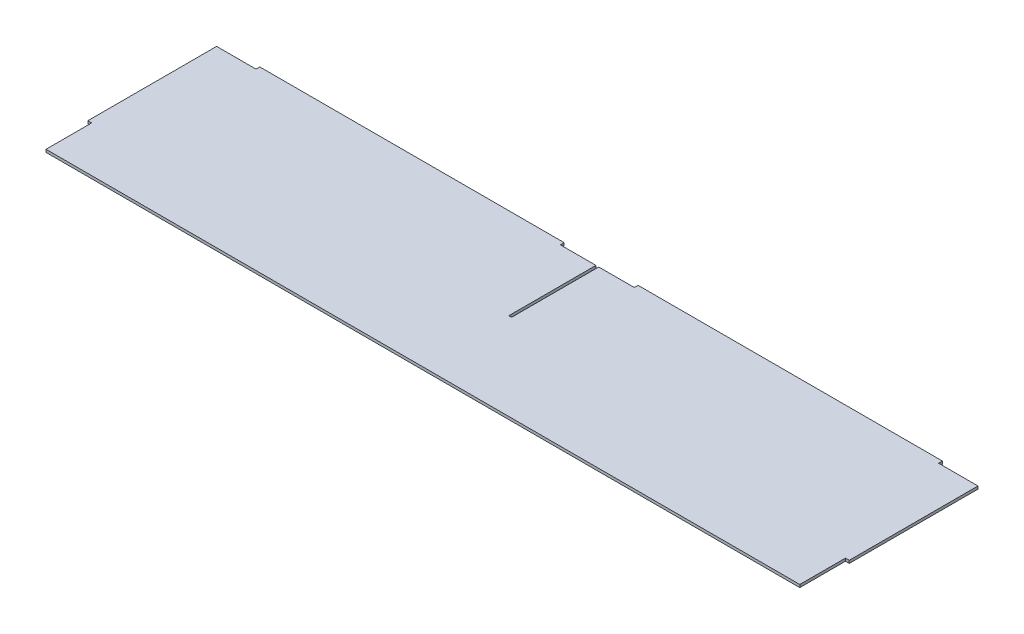
ISO-10303-21;
HEADER;
FILE_DESCRIPTION(('STEP AP214'),'2;1');
FILE_NAME('part.step','',(''),(''),'','','');
FILE_SCHEMA(('AUTOMOTIVE_DESIGN { 1 0 10303 214 1 1 1 1 }'));
ENDSEC;
DATA;
#1=APPLICATION_CONTEXT('core data for automotive mechanical design processes');
#2=APPLICATION_PROTOCOL_DEFINITION('international standard','automotive_design',2000,#1);
#3=PRODUCT_CONTEXT('',#1,'mechanical');
#4=PRODUCT('Part','Part','',(#3));
#5=PRODUCT_RELATED_PRODUCT_CATEGORY('part','',(#4));
#6=PRODUCT_DEFINITION_FORMATION('','',#4);
#7=PRODUCT_DEFINITION_CONTEXT('part definition',#1,'design');
#8=PRODUCT_DEFINITION('design','',#6,#7);
#9=PRODUCT_DEFINITION_SHAPE('','',#8);
#10=(LENGTH_UNIT() NAMED_UNIT(*) SI_UNIT(.MILLI.,.METRE.));
#11=(NAMED_UNIT(*) PLANE_ANGLE_UNIT() SI_UNIT($,.RADIAN.));
#12=(NAMED_UNIT(*) SI_UNIT($,.STERADIAN.) SOLID_ANGLE_UNIT());
#13=UNCERTAINTY_MEASURE_WITH_UNIT(LENGTH_MEASURE(1.E-05),#10,'distance_accuracy_value','');
#14=(GEOMETRIC_REPRESENTATION_CONTEXT(3) GLOBAL_UNCERTAINTY_ASSIGNED_CONTEXT((#13)) GLOBAL_UNIT_ASSIGNED_CONTEXT((#10,
#11,#12)) REPRESENTATION_CONTEXT('',''));
#15=CARTESIAN_POINT('',(0.,0.,0.));
#16=DIRECTION('',(0.,0.,1.));
#17=DIRECTION('',(1.,0.,0.));
#18=AXIS2_PLACEMENT_3D('',#15,#16,#17);
#19=CARTESIAN_POINT('',(0.,1.143,0.));
#20=DIRECTION('',(0.,1.,0.));
#21=DIRECTION('',(0.,0.,1.));
#22=AXIS2_PLACEMENT_3D('',#19,#20,#21);
#23=PLANE('',#22);
#24=DIRECTION('',(1.,0.,0.));
#25=VECTOR('',#24,1.);
#26=CARTESIAN_POINT('',(0.,1.143,0.));
#27=LINE('',#26,#25);
#28=CARTESIAN_POINT('',(-1.14299999999912,1.143,0.));
#29=VERTEX_POINT('',#28);
#30=CARTESIAN_POINT('',(1.19380000000088,1.143,0.));
#31=VERTEX_POINT('',#30);
#32=EDGE_CURVE('E179',#29,#31,#27,.T.);
#33=ORIENTED_EDGE('',*,*,#32,.F.);
#34=DIRECTION('',(0.,0.,1.));
#35=VECTOR('',#34,1.);
#36=CARTESIAN_POINT('',(-1.14299999999912,1.143,0.));
#37=LINE('',#36,#35);
#38=CARTESIAN_POINT('',(-1.14299999999913,1.143,-72.771));
#39=VERTEX_POINT('',#38);
#40=EDGE_CURVE('E187',#39,#29,#37,.T.);
#41=ORIENTED_EDGE('',*,*,#40,.F.);
#42=DIRECTION('',(-1.,0.,0.));
#43=VECTOR('',#42,1.);
#44=CARTESIAN_POINT('',(-317.6778,1.143,-72.771));
#45=LINE('',#44,#43);
#46=CARTESIAN_POINT('',(-30.8229000000014,1.143,-72.771));
#47=VERTEX_POINT('',#46);
#48=EDGE_CURVE('E307',#39,#47,#45,.T.);
#49=ORIENTED_EDGE('',*,*,#48,.T.);
#50=DIRECTION('',(0.,0.,1.));
#51=VECTOR('',#50,1.);
#52=CARTESIAN_POINT('',(-30.8229000000015,1.143,-75.946));
#53=LINE('',#52,#51);
#54=CARTESIAN_POINT('',(-30.8229000000015,1.143,-75.946));
#55=VERTEX_POINT('',#54);
#56=EDGE_CURVE('E282',#55,#47,#53,.T.);
#57=ORIENTED_EDGE('',*,*,#56,.F.);
#58=DIRECTION('',(1.,0.,0.));
#59=VECTOR('',#58,1.);
#60=CARTESIAN_POINT('',(-30.8229000000015,1.143,-75.946));
#61=LINE('',#60,#59);
#62=CARTESIAN_POINT('',(-284.823288937204,1.143,-75.946));
#63=VERTEX_POINT('',#62);
#64=EDGE_CURVE('E280',#63,#55,#61,.T.);
#65=ORIENTED_EDGE('',*,*,#64,.F.);
#66=DIRECTION('',(0.,0.,1.));
#67=VECTOR('',#66,1.);
#68=CARTESIAN_POINT('',(-284.823288937204,1.143,-75.946));
#69=LINE('',#68,#67);
#70=CARTESIAN_POINT('',(-284.823288937204,1.143,-72.771));
#71=VERTEX_POINT('',#70);
#72=EDGE_CURVE('E289',#63,#71,#69,.T.);
#73=ORIENTED_EDGE('',*,*,#72,.T.);
#74=CARTESIAN_POINT('',(-317.6778,1.143,-72.771));
#75=VERTEX_POINT('',#74);
#76=EDGE_CURVE('E301',#71,#75,#45,.T.);
#77=ORIENTED_EDGE('',*,*,#76,.T.);
#78=DIRECTION('',(0.,0.,1.));
#79=VECTOR('',#78,1.);
#80=CARTESIAN_POINT('',(-317.6778,1.143,-72.771));
#81=LINE('',#80,#79);
#82=CARTESIAN_POINT('',(-317.6778,1.143,34.671));
#83=VERTEX_POINT('',#82);
#84=EDGE_CURVE('E306',#75,#83,#81,.T.);
#85=ORIENTED_EDGE('',*,*,#84,.T.);
#86=DIRECTION('',(1.,0.,0.));
#87=VECTOR('',#86,1.);
#88=CARTESIAN_POINT('',(0.,1.143,34.671));
#89=LINE('',#88,#87);
#90=CARTESIAN_POINT('',(-314.5028,1.143,34.671));
#91=VERTEX_POINT('',#90);
#92=EDGE_CURVE('E230',#83,#91,#89,.T.);
#93=ORIENTED_EDGE('',*,*,#92,.T.);
#94=DIRECTION('',(0.,0.,-1.));
#95=VECTOR('',#94,1.);
#96=CARTESIAN_POINT('',(-314.5028,1.143,0.));
#97=LINE('',#96,#95);
#98=CARTESIAN_POINT('',(-314.5028,1.143,72.771));
#99=VERTEX_POINT('',#98);
#100=EDGE_CURVE('E228',#99,#91,#97,.T.);
#101=ORIENTED_EDGE('',*,*,#100,.F.);
#102=DIRECTION('',(1.,0.,0.));
#103=VECTOR('',#102,1.);
#104=CARTESIAN_POINT('',(-317.6778,1.143,72.771));
#105=LINE('',#104,#103);
#106=CARTESIAN_POINT('',(314.5028,1.143,72.771));
#107=VERTEX_POINT('',#106);
#108=EDGE_CURVE('E310',#99,#107,#105,.T.);
#109=ORIENTED_EDGE('',*,*,#108,.T.);
#110=DIRECTION('',(0.,0.,-1.));
#111=VECTOR('',#110,1.);
#112=CARTESIAN_POINT('',(314.5028,1.143,0.));
#113=LINE('',#112,#111);
#114=CARTESIAN_POINT('',(314.5028,1.143,34.671));
#115=VERTEX_POINT('',#114);
#116=EDGE_CURVE('E213',#107,#115,#113,.T.);
#117=ORIENTED_EDGE('',*,*,#116,.T.);
#118=DIRECTION('',(-1.,0.,0.));
#119=VECTOR('',#118,1.);
#120=CARTESIAN_POINT('',(0.,1.143,34.671));
#121=LINE('',#120,#119);
#122=CARTESIAN_POINT('',(317.6778,1.143,34.671));
#123=VERTEX_POINT('',#122);
#124=EDGE_CURVE('E216',#123,#115,#121,.T.);
#125=ORIENTED_EDGE('',*,*,#124,.F.);
#126=DIRECTION('',(0.,0.,-1.));
#127=VECTOR('',#126,1.);
#128=CARTESIAN_POINT('',(317.6778,1.143,-72.771));
#129=LINE('',#128,#127);
#130=CARTESIAN_POINT('',(317.6778,1.143,-72.771));
#131=VERTEX_POINT('',#130);
#132=EDGE_CURVE('E299',#123,#131,#129,.T.);
#133=ORIENTED_EDGE('',*,*,#132,.T.);
#134=CARTESIAN_POINT('',(284.822900000001,1.143,-72.771));
#135=VERTEX_POINT('',#134);
#136=EDGE_CURVE('E303',#131,#135,#45,.T.);
#137=ORIENTED_EDGE('',*,*,#136,.T.);
#138=DIRECTION('',(0.,0.,1.));
#139=VECTOR('',#138,1.);
#140=CARTESIAN_POINT('',(284.822900000001,1.143,-75.946));
#141=LINE('',#140,#139);
#142=CARTESIAN_POINT('',(284.822900000001,1.143,-75.946));
#143=VERTEX_POINT('',#142);
#144=EDGE_CURVE('E256',#143,#135,#141,.T.);
#145=ORIENTED_EDGE('',*,*,#144,.F.);
#146=DIRECTION('',(1.,0.,0.));
#147=VECTOR('',#146,1.);
#148=CARTESIAN_POINT('',(284.822900000001,1.143,-75.946));
#149=LINE('',#148,#147);
#150=CARTESIAN_POINT('',(30.8225110627992,1.143,-75.946));
#151=VERTEX_POINT('',#150);
#152=EDGE_CURVE('E254',#151,#143,#149,.T.);
#153=ORIENTED_EDGE('',*,*,#152,.F.);
#154=DIRECTION('',(0.,0.,1.));
#155=VECTOR('',#154,1.);
#156=CARTESIAN_POINT('',(30.8225110627992,1.143,-75.946));
#157=LINE('',#156,#155);
#158=CARTESIAN_POINT('',(30.8225110627992,1.143,-72.771));
#159=VERTEX_POINT('',#158);
#160=EDGE_CURVE('E263',#151,#159,#157,.T.);
#161=ORIENTED_EDGE('',*,*,#160,.T.);
#162=CARTESIAN_POINT('',(1.19380000000091,1.143,-72.771));
#163=VERTEX_POINT('',#162);
#164=EDGE_CURVE('E197',#159,#163,#45,.T.);
#165=ORIENTED_EDGE('',*,*,#164,.T.);
#166=DIRECTION('',(0.,0.,1.));
#167=VECTOR('',#166,1.);
#168=CARTESIAN_POINT('',(1.19380000000088,1.143,0.));
#169=LINE('',#168,#167);
#170=EDGE_CURVE('E56',#163,#31,#169,.T.);
#171=ORIENTED_EDGE('',*,*,#170,.T.);
#172=EDGE_LOOP('',(#33,#41,#49,#57,#65,#73,#77,#85,#93,#101,#109,#117,#125,#133,#137,#145,#153,
#161,#165,#171));
#173=FACE_BOUND('',#172,.T.);
#174=ADVANCED_FACE('F41',(#173),#23,.T.);
#175=CARTESIAN_POINT('',(0.,-1.143,0.));
#176=DIRECTION('',(0.,1.,0.));
#177=DIRECTION('',(0.,0.,1.));
#178=AXIS2_PLACEMENT_3D('',#175,#176,#177);
#179=PLANE('',#178);
#180=DIRECTION('',(0.,0.,1.));
#181=VECTOR('',#180,1.);
#182=CARTESIAN_POINT('',(-1.14299999999912,-1.143,0.));
#183=LINE('',#182,#181);
#184=CARTESIAN_POINT('',(-1.14299999999913,-1.143,-72.771));
#185=VERTEX_POINT('',#184);
#186=CARTESIAN_POINT('',(-1.14299999999912,-1.143,0.));
#187=VERTEX_POINT('',#186);
#188=EDGE_CURVE('E198',#185,#187,#183,.T.);
#189=ORIENTED_EDGE('',*,*,#188,.T.);
#190=DIRECTION('',(1.,0.,0.));
#191=VECTOR('',#190,1.);
#192=CARTESIAN_POINT('',(0.,-1.143,0.));
#193=LINE('',#192,#191);
#194=CARTESIAN_POINT('',(1.19380000000088,-1.143,0.));
#195=VERTEX_POINT('',#194);
#196=EDGE_CURVE('E201',#187,#195,#193,.T.);
#197=ORIENTED_EDGE('',*,*,#196,.T.);
#198=DIRECTION('',(0.,0.,1.));
#199=VECTOR('',#198,1.);
#200=CARTESIAN_POINT('',(1.19380000000088,-1.143,0.));
#201=LINE('',#200,#199);
#202=CARTESIAN_POINT('',(1.19380000000087,-1.143,-72.771));
#203=VERTEX_POINT('',#202);
#204=EDGE_CURVE('E191',#203,#195,#201,.T.);
#205=ORIENTED_EDGE('',*,*,#204,.F.);
#206=DIRECTION('',(-1.,0.,0.));
#207=VECTOR('',#206,1.);
#208=CARTESIAN_POINT('',(-317.6778,-1.143,-72.771));
#209=LINE('',#208,#207);
#210=CARTESIAN_POINT('',(30.8265115627992,-1.143,-72.771));
#211=VERTEX_POINT('',#210);
#212=EDGE_CURVE('E318',#211,#203,#209,.T.);
#213=ORIENTED_EDGE('',*,*,#212,.F.);
#214=DIRECTION('',(0.,0.,1.));
#215=VECTOR('',#214,1.);
#216=CARTESIAN_POINT('',(30.8265115627992,-1.143,-75.946));
#217=LINE('',#216,#215);
#218=CARTESIAN_POINT('',(30.8265115627992,-1.143,-75.946));
#219=VERTEX_POINT('',#218);
#220=EDGE_CURVE('E265',#219,#211,#217,.T.);
#221=ORIENTED_EDGE('',*,*,#220,.F.);
#222=DIRECTION('',(-1.,0.,0.));
#223=VECTOR('',#222,1.);
#224=CARTESIAN_POINT('',(284.826900500001,-1.143,-75.946));
#225=LINE('',#224,#223);
#226=CARTESIAN_POINT('',(284.826900500001,-1.143,-75.946));
#227=VERTEX_POINT('',#226);
#228=EDGE_CURVE('E249',#227,#219,#225,.T.);
#229=ORIENTED_EDGE('',*,*,#228,.F.);
#230=DIRECTION('',(0.,0.,1.));
#231=VECTOR('',#230,1.);
#232=CARTESIAN_POINT('',(284.826900500001,-1.143,-75.946));
#233=LINE('',#232,#231);
#234=CARTESIAN_POINT('',(284.826900500001,-1.143,-72.771));
#235=VERTEX_POINT('',#234);
#236=EDGE_CURVE('E268',#227,#235,#233,.T.);
#237=ORIENTED_EDGE('',*,*,#236,.T.);
#238=CARTESIAN_POINT('',(317.6778,-1.143,-72.771));
#239=VERTEX_POINT('',#238);
#240=EDGE_CURVE('E315',#239,#235,#209,.T.);
#241=ORIENTED_EDGE('',*,*,#240,.F.);
#242=DIRECTION('',(0.,0.,-1.));
#243=VECTOR('',#242,1.);
#244=CARTESIAN_POINT('',(317.6778,-1.143,-72.771));
#245=LINE('',#244,#243);
#246=CARTESIAN_POINT('',(317.6778,-1.143,34.671));
#247=VERTEX_POINT('',#246);
#248=EDGE_CURVE('E298',#247,#239,#245,.T.);
#249=ORIENTED_EDGE('',*,*,#248,.F.);
#250=DIRECTION('',(-1.,0.,0.));
#251=VECTOR('',#250,1.);
#252=CARTESIAN_POINT('',(0.,-1.143,34.671));
#253=LINE('',#252,#251);
#254=CARTESIAN_POINT('',(314.5028,-1.143,34.671));
#255=VERTEX_POINT('',#254);
#256=EDGE_CURVE('E64',#247,#255,#253,.T.);
#257=ORIENTED_EDGE('',*,*,#256,.T.);
#258=DIRECTION('',(0.,0.,-1.));
#259=VECTOR('',#258,1.);
#260=CARTESIAN_POINT('',(314.5028,-1.143,0.));
#261=LINE('',#260,#259);
#262=CARTESIAN_POINT('',(314.5028,-1.143,72.771));
#263=VERTEX_POINT('',#262);
#264=EDGE_CURVE('E210',#263,#255,#261,.T.);
#265=ORIENTED_EDGE('',*,*,#264,.F.);
#266=DIRECTION('',(1.,0.,0.));
#267=VECTOR('',#266,1.);
#268=CARTESIAN_POINT('',(-317.6778,-1.143,72.771));
#269=LINE('',#268,#267);
#270=CARTESIAN_POINT('',(-314.5028,-1.143,72.771));
#271=VERTEX_POINT('',#270);
#272=EDGE_CURVE('E302',#271,#263,#269,.T.);
#273=ORIENTED_EDGE('',*,*,#272,.F.);
#274=DIRECTION('',(0.,0.,-1.));
#275=VECTOR('',#274,1.);
#276=CARTESIAN_POINT('',(-314.5028,-1.143,0.));
#277=LINE('',#276,#275);
#278=CARTESIAN_POINT('',(-314.5028,-1.143,34.671));
#279=VERTEX_POINT('',#278);
#280=EDGE_CURVE('E224',#271,#279,#277,.T.);
#281=ORIENTED_EDGE('',*,*,#280,.T.);
#282=DIRECTION('',(1.,0.,0.));
#283=VECTOR('',#282,1.);
#284=CARTESIAN_POINT('',(0.,-1.143,34.671));
#285=LINE('',#284,#283);
#286=CARTESIAN_POINT('',(-317.6778,-1.143,34.671));
#287=VERTEX_POINT('',#286);
#288=EDGE_CURVE('E231',#287,#279,#285,.T.);
#289=ORIENTED_EDGE('',*,*,#288,.F.);
#290=DIRECTION('',(0.,0.,1.));
#291=VECTOR('',#290,1.);
#292=CARTESIAN_POINT('',(-317.6778,-1.143,-72.771));
#293=LINE('',#292,#291);
#294=CARTESIAN_POINT('',(-317.6778,-1.143,-72.771));
#295=VERTEX_POINT('',#294);
#296=EDGE_CURVE('E317',#295,#287,#293,.T.);
#297=ORIENTED_EDGE('',*,*,#296,.F.);
#298=CARTESIAN_POINT('',(-284.819288437204,-1.143,-72.771));
#299=VERTEX_POINT('',#298);
#300=EDGE_CURVE('E314',#299,#295,#209,.T.);
#301=ORIENTED_EDGE('',*,*,#300,.F.);
#302=DIRECTION('',(0.,0.,1.));
#303=VECTOR('',#302,1.);
#304=CARTESIAN_POINT('',(-284.819288437204,-1.143,-75.946));
#305=LINE('',#304,#303);
#306=CARTESIAN_POINT('',(-284.819288437204,-1.143,-75.946));
#307=VERTEX_POINT('',#306);
#308=EDGE_CURVE('E292',#307,#299,#305,.T.);
#309=ORIENTED_EDGE('',*,*,#308,.F.);
#310=DIRECTION('',(-1.,0.,0.));
#311=VECTOR('',#310,1.);
#312=CARTESIAN_POINT('',(-30.8188995000015,-1.143,-75.946));
#313=LINE('',#312,#311);
#314=CARTESIAN_POINT('',(-30.8188995000015,-1.143,-75.946));
#315=VERTEX_POINT('',#314);
#316=EDGE_CURVE('E275',#315,#307,#313,.T.);
#317=ORIENTED_EDGE('',*,*,#316,.F.);
#318=DIRECTION('',(0.,0.,1.));
#319=VECTOR('',#318,1.);
#320=CARTESIAN_POINT('',(-30.8188995000015,-1.143,-75.946));
#321=LINE('',#320,#319);
#322=CARTESIAN_POINT('',(-30.8188995000015,-1.143,-72.771));
#323=VERTEX_POINT('',#322);
#324=EDGE_CURVE('E295',#315,#323,#321,.T.);
#325=ORIENTED_EDGE('',*,*,#324,.T.);
#326=EDGE_CURVE('E319',#185,#323,#209,.T.);
#327=ORIENTED_EDGE('',*,*,#326,.F.);
#328=EDGE_LOOP('',(#189,#197,#205,#213,#221,#229,#237,#241,#249,#257,#265,#273,#281,#289,#297,
#301,#309,#317,#325,#327));
#329=FACE_BOUND('',#328,.T.);
#330=ADVANCED_FACE('F334',(#329),#179,.F.);
#331=CARTESIAN_POINT('',(-317.6778,1.143,-72.771));
#332=DIRECTION('',(0.,0.,1.));
#333=DIRECTION('',(1.,0.,0.));
#334=AXIS2_PLACEMENT_3D('',#331,#332,#333);
#335=PLANE('',#334);
#336=DIRECTION('',(0.,-1.,0.));
#337=VECTOR('',#336,1.);
#338=CARTESIAN_POINT('',(-1.14299999999913,1.143,-72.771));
#339=LINE('',#338,#337);
#340=EDGE_CURVE('E207',#39,#185,#339,.T.);
#341=ORIENTED_EDGE('',*,*,#340,.T.);
#342=ORIENTED_EDGE('',*,*,#326,.T.);
#343=DIRECTION('',(0.00174999732031877,-0.999998468753517,0.));
#344=VECTOR('',#343,1.);
#345=CARTESIAN_POINT('',(-30.8188995000015,-1.143,-72.771));
#346=LINE('',#345,#344);
#347=EDGE_CURVE('E271',#47,#323,#346,.T.);
#348=ORIENTED_EDGE('',*,*,#347,.F.);
#349=ORIENTED_EDGE('',*,*,#48,.F.);
#350=EDGE_LOOP('',(#341,#342,#348,#349));
#351=FACE_BOUND('',#350,.T.);
#352=ADVANCED_FACE('F348',(#351),#335,.F.);
#353=CARTESIAN_POINT('',(317.6778,1.143,-72.771));
#354=DIRECTION('',(-1.,0.,0.));
#355=DIRECTION('',(0.,0.,1.));
#356=AXIS2_PLACEMENT_3D('',#353,#354,#355);
#357=PLANE('',#356);
#358=DIRECTION('',(0.,-1.,0.));
#359=VECTOR('',#358,1.);
#360=CARTESIAN_POINT('',(317.6778,1.143,34.671));
#361=LINE('',#360,#359);
#362=EDGE_CURVE('E225',#123,#247,#361,.T.);
#363=ORIENTED_EDGE('',*,*,#362,.T.);
#364=ORIENTED_EDGE('',*,*,#248,.T.);
#365=DIRECTION('',(0.,-1.,0.));
#366=VECTOR('',#365,1.);
#367=CARTESIAN_POINT('',(317.6778,1.143,-72.771));
#368=LINE('',#367,#366);
#369=EDGE_CURVE('E11',#131,#239,#368,.T.);
#370=ORIENTED_EDGE('',*,*,#369,.F.);
#371=ORIENTED_EDGE('',*,*,#132,.F.);
#372=EDGE_LOOP('',(#363,#364,#370,#371));
#373=FACE_BOUND('',#372,.T.);
#374=ADVANCED_FACE('F43',(#373),#357,.F.);
#375=CARTESIAN_POINT('',(-317.6778,1.143,72.771));
#376=DIRECTION('',(0.,0.,-1.));
#377=DIRECTION('',(-1.,0.,0.));
#378=AXIS2_PLACEMENT_3D('',#375,#376,#377);
#379=PLANE('',#378);
#380=ORIENTED_EDGE('',*,*,#272,.T.);
#381=DIRECTION('',(0.,-1.,0.));
#382=VECTOR('',#381,1.);
#383=CARTESIAN_POINT('',(314.5028,1.143,72.771));
#384=LINE('',#383,#382);
#385=EDGE_CURVE('E222',#107,#263,#384,.T.);
#386=ORIENTED_EDGE('',*,*,#385,.F.);
#387=ORIENTED_EDGE('',*,*,#108,.F.);
#388=DIRECTION('',(0.,-1.,0.));
#389=VECTOR('',#388,1.);
#390=CARTESIAN_POINT('',(-314.5028,1.143,72.771));
#391=LINE('',#390,#389);
#392=EDGE_CURVE('E234',#99,#271,#391,.T.);
#393=ORIENTED_EDGE('',*,*,#392,.T.);
#394=EDGE_LOOP('',(#380,#386,#387,#393));
#395=FACE_BOUND('',#394,.T.);
#396=ADVANCED_FACE('F386',(#395),#379,.F.);
#397=DIRECTION('',(0.00174999732031422,-0.999998468753517,0.));
#398=VECTOR('',#397,1.);
#399=CARTESIAN_POINT('',(284.826900500001,-1.143,-72.771));
#400=LINE('',#399,#398);
#401=EDGE_CURVE('E241',#135,#235,#400,.T.);
#402=ORIENTED_EDGE('',*,*,#401,.F.);
#403=ORIENTED_EDGE('',*,*,#136,.F.);
#404=ORIENTED_EDGE('',*,*,#369,.T.);
#405=ORIENTED_EDGE('',*,*,#240,.T.);
#406=EDGE_LOOP('',(#402,#403,#404,#405));
#407=FACE_BOUND('',#406,.T.);
#408=ADVANCED_FACE('F389',(#407),#335,.F.);
#409=ORIENTED_EDGE('',*,*,#212,.T.);
#410=DIRECTION('',(0.,-1.,0.));
#411=VECTOR('',#410,1.);
#412=CARTESIAN_POINT('',(1.19380000000087,1.143,-72.771));
#413=LINE('',#412,#411);
#414=EDGE_CURVE('E193',#163,#203,#413,.T.);
#415=ORIENTED_EDGE('',*,*,#414,.F.);
#416=ORIENTED_EDGE('',*,*,#164,.F.);
#417=DIRECTION('',(-0.00174999732031877,0.999998468753517,0.));
#418=VECTOR('',#417,1.);
#419=CARTESIAN_POINT('',(30.8225110627992,1.143,-72.771));
#420=LINE('',#419,#418);
#421=EDGE_CURVE('E250',#211,#159,#420,.T.);
#422=ORIENTED_EDGE('',*,*,#421,.F.);
#423=EDGE_LOOP('',(#409,#415,#416,#422));
#424=FACE_BOUND('',#423,.T.);
#425=ADVANCED_FACE('F362',(#424),#335,.F.);
#426=DIRECTION('',(-0.00174999732031422,0.999998468753517,0.));
#427=VECTOR('',#426,1.);
#428=CARTESIAN_POINT('',(-284.823288937204,1.143,-72.771));
#429=LINE('',#428,#427);
#430=EDGE_CURVE('E276',#299,#71,#429,.T.);
#431=ORIENTED_EDGE('',*,*,#430,.F.);
#432=ORIENTED_EDGE('',*,*,#300,.T.);
#433=DIRECTION('',(0.,-1.,0.));
#434=VECTOR('',#433,1.);
#435=CARTESIAN_POINT('',(-317.6778,1.143,-72.771));
#436=LINE('',#435,#434);
#437=EDGE_CURVE('E49',#75,#295,#436,.T.);
#438=ORIENTED_EDGE('',*,*,#437,.F.);
#439=ORIENTED_EDGE('',*,*,#76,.F.);
#440=EDGE_LOOP('',(#431,#432,#438,#439));
#441=FACE_BOUND('',#440,.T.);
#442=ADVANCED_FACE('F358',(#441),#335,.F.);
#443=CARTESIAN_POINT('',(-317.6778,1.143,-72.771));
#444=DIRECTION('',(1.,0.,0.));
#445=DIRECTION('',(0.,0.,-1.));
#446=AXIS2_PLACEMENT_3D('',#443,#444,#445);
#447=PLANE('',#446);
#448=ORIENTED_EDGE('',*,*,#296,.T.);
#449=DIRECTION('',(0.,-1.,0.));
#450=VECTOR('',#449,1.);
#451=CARTESIAN_POINT('',(-317.6778,1.143,34.671));
#452=LINE('',#451,#450);
#453=EDGE_CURVE('E242',#83,#287,#452,.T.);
#454=ORIENTED_EDGE('',*,*,#453,.F.);
#455=ORIENTED_EDGE('',*,*,#84,.F.);
#456=ORIENTED_EDGE('',*,*,#437,.T.);
#457=EDGE_LOOP('',(#448,#454,#455,#456));
#458=FACE_BOUND('',#457,.T.);
#459=ADVANCED_FACE('F328',(#458),#447,.F.);
#460=CARTESIAN_POINT('',(-30.8188995000015,-1.143,-75.946));
#461=DIRECTION('',(-0.999998468753517,-0.00174999732031877,0.));
#462=DIRECTION('',(0.00174999732031877,-0.999998468753517,0.));
#463=AXIS2_PLACEMENT_3D('',#460,#461,#462);
#464=PLANE('',#463);
#465=ORIENTED_EDGE('',*,*,#347,.T.);
#466=ORIENTED_EDGE('',*,*,#324,.F.);
#467=DIRECTION('',(0.00174999732031877,-0.999998468753517,0.));
#468=VECTOR('',#467,1.);
#469=CARTESIAN_POINT('',(-30.8188995000015,-1.143,-75.946));
#470=LINE('',#469,#468);
#471=EDGE_CURVE('E272',#55,#315,#470,.T.);
#472=ORIENTED_EDGE('',*,*,#471,.F.);
#473=ORIENTED_EDGE('',*,*,#56,.T.);
#474=EDGE_LOOP('',(#465,#466,#472,#473));
#475=FACE_BOUND('',#474,.T.);
#476=ADVANCED_FACE('F352',(#475),#464,.F.);
#477=CARTESIAN_POINT('',(-284.823288937204,1.143,-75.946));
#478=DIRECTION('',(0.999998468753517,0.00174999732031422,0.));
#479=DIRECTION('',(-0.00174999732031422,0.999998468753517,0.));
#480=AXIS2_PLACEMENT_3D('',#477,#478,#479);
#481=PLANE('',#480);
#482=ORIENTED_EDGE('',*,*,#430,.T.);
#483=ORIENTED_EDGE('',*,*,#72,.F.);
#484=DIRECTION('',(-0.00174999732031422,0.999998468753517,0.));
#485=VECTOR('',#484,1.);
#486=CARTESIAN_POINT('',(-284.823288937204,1.143,-75.946));
#487=LINE('',#486,#485);
#488=EDGE_CURVE('E278',#307,#63,#487,.T.);
#489=ORIENTED_EDGE('',*,*,#488,.F.);
#490=ORIENTED_EDGE('',*,*,#308,.T.);
#491=EDGE_LOOP('',(#482,#483,#489,#490));
#492=FACE_BOUND('',#491,.T.);
#493=ADVANCED_FACE('F357',(#492),#481,.F.);
#494=CARTESIAN_POINT('',(0.,0.,-75.946));
#495=DIRECTION('',(0.,0.,1.));
#496=DIRECTION('',(1.,0.,0.));
#497=AXIS2_PLACEMENT_3D('',#494,#495,#496);
#498=PLANE('',#497);
#499=ORIENTED_EDGE('',*,*,#471,.T.);
#500=ORIENTED_EDGE('',*,*,#316,.T.);
#501=ORIENTED_EDGE('',*,*,#488,.T.);
#502=ORIENTED_EDGE('',*,*,#64,.T.);
#503=EDGE_LOOP('',(#499,#500,#501,#502));
#504=FACE_BOUND('',#503,.T.);
#505=ADVANCED_FACE('F354',(#504),#498,.F.);
#506=CARTESIAN_POINT('',(284.826900500001,-1.143,-75.946));
#507=DIRECTION('',(-0.999998468753517,-0.00174999732031422,0.));
#508=DIRECTION('',(0.00174999732031422,-0.999998468753517,0.));
#509=AXIS2_PLACEMENT_3D('',#506,#507,#508);
#510=PLANE('',#509);
#511=ORIENTED_EDGE('',*,*,#401,.T.);
#512=ORIENTED_EDGE('',*,*,#236,.F.);
#513=DIRECTION('',(0.00174999732031422,-0.999998468753517,0.));
#514=VECTOR('',#513,1.);
#515=CARTESIAN_POINT('',(284.826900500001,-1.143,-75.946));
#516=LINE('',#515,#514);
#517=EDGE_CURVE('E246',#143,#227,#516,.T.);
#518=ORIENTED_EDGE('',*,*,#517,.F.);
#519=ORIENTED_EDGE('',*,*,#144,.T.);
#520=EDGE_LOOP('',(#511,#512,#518,#519));
#521=FACE_BOUND('',#520,.T.);
#522=ADVANCED_FACE('F425',(#521),#510,.F.);
#523=CARTESIAN_POINT('',(30.8225110627992,1.143,-75.946));
#524=DIRECTION('',(0.999998468753517,0.00174999732031877,0.));
#525=DIRECTION('',(-0.00174999732031877,0.999998468753517,0.));
#526=AXIS2_PLACEMENT_3D('',#523,#524,#525);
#527=PLANE('',#526);
#528=ORIENTED_EDGE('',*,*,#421,.T.);
#529=ORIENTED_EDGE('',*,*,#160,.F.);
#530=DIRECTION('',(-0.00174999732031877,0.999998468753517,0.));
#531=VECTOR('',#530,1.);
#532=CARTESIAN_POINT('',(30.8225110627992,1.143,-75.946));
#533=LINE('',#532,#531);
#534=EDGE_CURVE('E252',#219,#151,#533,.T.);
#535=ORIENTED_EDGE('',*,*,#534,.F.);
#536=ORIENTED_EDGE('',*,*,#220,.T.);
#537=EDGE_LOOP('',(#528,#529,#535,#536));
#538=FACE_BOUND('',#537,.T.);
#539=ADVANCED_FACE('F432',(#538),#527,.F.);
#540=CARTESIAN_POINT('',(0.,0.,-75.946));
#541=DIRECTION('',(0.,0.,1.));
#542=DIRECTION('',(1.,0.,0.));
#543=AXIS2_PLACEMENT_3D('',#540,#541,#542);
#544=PLANE('',#543);
#545=ORIENTED_EDGE('',*,*,#517,.T.);
#546=ORIENTED_EDGE('',*,*,#228,.T.);
#547=ORIENTED_EDGE('',*,*,#534,.T.);
#548=ORIENTED_EDGE('',*,*,#152,.T.);
#549=EDGE_LOOP('',(#545,#546,#547,#548));
#550=FACE_BOUND('',#549,.T.);
#551=ADVANCED_FACE('F440',(#550),#544,.F.);
#552=CARTESIAN_POINT('',(-314.5028,1.143,0.));
#553=DIRECTION('',(-1.,0.,0.));
#554=DIRECTION('',(0.,0.,1.));
#555=AXIS2_PLACEMENT_3D('',#552,#553,#554);
#556=PLANE('',#555);
#557=ORIENTED_EDGE('',*,*,#280,.F.);
#558=ORIENTED_EDGE('',*,*,#392,.F.);
#559=ORIENTED_EDGE('',*,*,#100,.T.);
#560=DIRECTION('',(0.,-1.,0.));
#561=VECTOR('',#560,1.);
#562=CARTESIAN_POINT('',(-314.5028,1.143,34.671));
#563=LINE('',#562,#561);
#564=EDGE_CURVE('E239',#91,#279,#563,.T.);
#565=ORIENTED_EDGE('',*,*,#564,.T.);
#566=EDGE_LOOP('',(#557,#558,#559,#565));
#567=FACE_BOUND('',#566,.T.);
#568=ADVANCED_FACE('F447',(#567),#556,.T.);
#569=CARTESIAN_POINT('',(0.,1.143,34.671));
#570=DIRECTION('',(0.,0.,-1.));
#571=DIRECTION('',(-1.,0.,0.));
#572=AXIS2_PLACEMENT_3D('',#569,#570,#571);
#573=PLANE('',#572);
#574=ORIENTED_EDGE('',*,*,#288,.T.);
#575=ORIENTED_EDGE('',*,*,#564,.F.);
#576=ORIENTED_EDGE('',*,*,#92,.F.);
#577=ORIENTED_EDGE('',*,*,#453,.T.);
#578=EDGE_LOOP('',(#574,#575,#576,#577));
#579=FACE_BOUND('',#578,.T.);
#580=ADVANCED_FACE('F339',(#579),#573,.F.);
#581=CARTESIAN_POINT('',(314.5028,1.143,0.));
#582=DIRECTION('',(-1.,0.,0.));
#583=DIRECTION('',(0.,0.,1.));
#584=AXIS2_PLACEMENT_3D('',#581,#582,#583);
#585=PLANE('',#584);
#586=ORIENTED_EDGE('',*,*,#264,.T.);
#587=DIRECTION('',(0.,-1.,0.));
#588=VECTOR('',#587,1.);
#589=CARTESIAN_POINT('',(314.5028,1.143,34.671));
#590=LINE('',#589,#588);
#591=EDGE_CURVE('E218',#115,#255,#590,.T.);
#592=ORIENTED_EDGE('',*,*,#591,.F.);
#593=ORIENTED_EDGE('',*,*,#116,.F.);
#594=ORIENTED_EDGE('',*,*,#385,.T.);
#595=EDGE_LOOP('',(#586,#592,#593,#594));
#596=FACE_BOUND('',#595,.T.);
#597=ADVANCED_FACE('F375',(#596),#585,.F.);
#598=CARTESIAN_POINT('',(0.,1.143,34.671));
#599=DIRECTION('',(0.,0.,1.));
#600=DIRECTION('',(1.,0.,0.));
#601=AXIS2_PLACEMENT_3D('',#598,#599,#600);
#602=PLANE('',#601);
#603=ORIENTED_EDGE('',*,*,#256,.F.);
#604=ORIENTED_EDGE('',*,*,#362,.F.);
#605=ORIENTED_EDGE('',*,*,#124,.T.);
#606=ORIENTED_EDGE('',*,*,#591,.T.);
#607=EDGE_LOOP('',(#603,#604,#605,#606));
#608=FACE_BOUND('',#607,.T.);
#609=ADVANCED_FACE('F368',(#608),#602,.T.);
#610=CARTESIAN_POINT('',(-1.14299999999912,1.143,0.));
#611=DIRECTION('',(1.,0.,0.));
#612=DIRECTION('',(0.,0.,-1.));
#613=AXIS2_PLACEMENT_3D('',#610,#611,#612);
#614=PLANE('',#613);
#615=ORIENTED_EDGE('',*,*,#188,.F.);
#616=ORIENTED_EDGE('',*,*,#340,.F.);
#617=ORIENTED_EDGE('',*,*,#40,.T.);
#618=DIRECTION('',(0.,-1.,0.));
#619=VECTOR('',#618,1.);
#620=CARTESIAN_POINT('',(-1.14299999999912,1.143,0.));
#621=LINE('',#620,#619);
#622=EDGE_CURVE('E184',#29,#187,#621,.T.);
#623=ORIENTED_EDGE('',*,*,#622,.T.);
#624=EDGE_LOOP('',(#615,#616,#617,#623));
#625=FACE_BOUND('',#624,.T.);
#626=ADVANCED_FACE('F366',(#625),#614,.T.);
#627=CARTESIAN_POINT('',(0.,1.143,0.));
#628=DIRECTION('',(0.,0.,-1.));
#629=DIRECTION('',(-1.,0.,0.));
#630=AXIS2_PLACEMENT_3D('',#627,#628,#629);
#631=PLANE('',#630);
#632=ORIENTED_EDGE('',*,*,#196,.F.);
#633=ORIENTED_EDGE('',*,*,#622,.F.);
#634=ORIENTED_EDGE('',*,*,#32,.T.);
#635=DIRECTION('',(0.,-1.,0.));
#636=VECTOR('',#635,1.);
#637=CARTESIAN_POINT('',(1.19380000000088,1.143,0.));
#638=LINE('',#637,#636);
#639=EDGE_CURVE('E182',#31,#195,#638,.T.);
#640=ORIENTED_EDGE('',*,*,#639,.T.);
#641=EDGE_LOOP('',(#632,#633,#634,#640));
#642=FACE_BOUND('',#641,.T.);
#643=ADVANCED_FACE('F181',(#642),#631,.T.);
#644=CARTESIAN_POINT('',(1.19380000000088,1.143,0.));
#645=DIRECTION('',(1.,0.,0.));
#646=DIRECTION('',(0.,0.,-1.));
#647=AXIS2_PLACEMENT_3D('',#644,#645,#646);
#648=PLANE('',#647);
#649=ORIENTED_EDGE('',*,*,#204,.T.);
#650=ORIENTED_EDGE('',*,*,#639,.F.);
#651=ORIENTED_EDGE('',*,*,#170,.F.);
#652=ORIENTED_EDGE('',*,*,#414,.T.);
#653=EDGE_LOOP('',(#649,#650,#651,#652));
#654=FACE_BOUND('',#653,.T.);
#655=ADVANCED_FACE('F189',(#654),#648,.F.);
#656=CLOSED_SHELL('',(#174,#330,#352,#374,#396,#408,#425,#442,#459,#476,#493,#505,#522,#539,
#551,#568,#580,#597,#609,#626,#643,#655));
#657=MANIFOLD_SOLID_BREP('B2',#656);
#658=ADVANCED_BREP_SHAPE_REPRESENTATION('',(#18,#657),#14);
#659=SHAPE_DEFINITION_REPRESENTATION(#9,#658);
ENDSEC;
END-ISO-10303-21;
